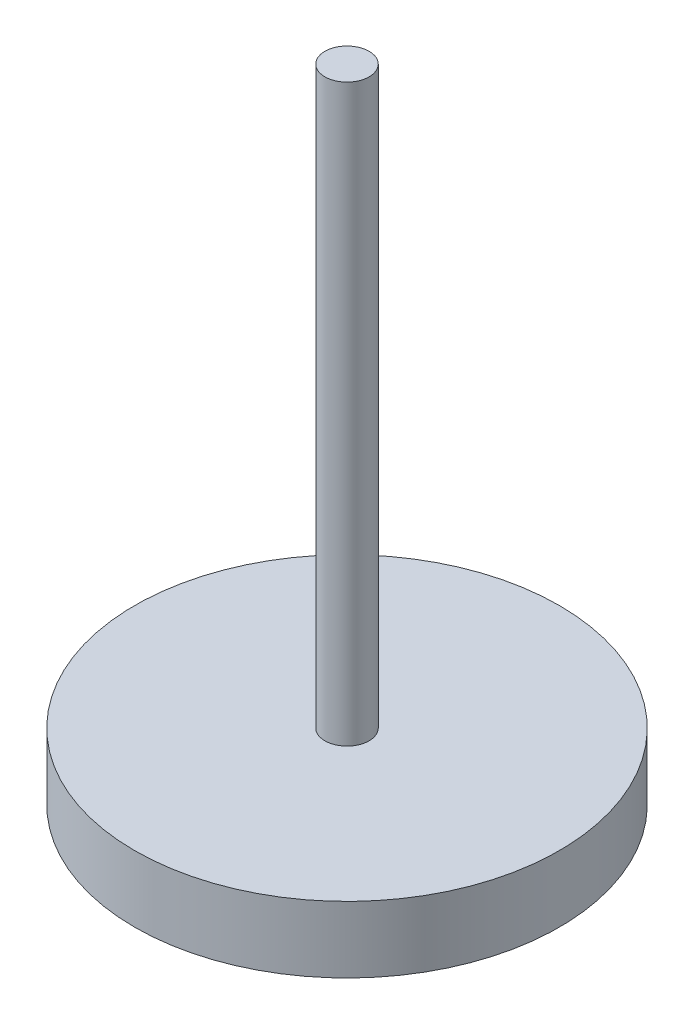
ISO-10303-21;
HEADER;
FILE_DESCRIPTION(('STEP AP214'),'2;1');
FILE_NAME('part.step','',(''),(''),'','','');
FILE_SCHEMA(('AUTOMOTIVE_DESIGN { 1 0 10303 214 1 1 1 1 }'));
ENDSEC;
DATA;
#1=APPLICATION_CONTEXT('core data for automotive mechanical design processes');
#2=APPLICATION_PROTOCOL_DEFINITION('international standard','automotive_design',2000,#1);
#3=PRODUCT_CONTEXT('',#1,'mechanical');
#4=PRODUCT('Part','Part','',(#3));
#5=PRODUCT_RELATED_PRODUCT_CATEGORY('part','',(#4));
#6=PRODUCT_DEFINITION_FORMATION('','',#4);
#7=PRODUCT_DEFINITION_CONTEXT('part definition',#1,'design');
#8=PRODUCT_DEFINITION('design','',#6,#7);
#9=PRODUCT_DEFINITION_SHAPE('','',#8);
#10=(LENGTH_UNIT() NAMED_UNIT(*) SI_UNIT(.MILLI.,.METRE.));
#11=(NAMED_UNIT(*) PLANE_ANGLE_UNIT() SI_UNIT($,.RADIAN.));
#12=(NAMED_UNIT(*) SI_UNIT($,.STERADIAN.) SOLID_ANGLE_UNIT());
#13=UNCERTAINTY_MEASURE_WITH_UNIT(LENGTH_MEASURE(1.E-05),#10,'distance_accuracy_value','');
#14=(GEOMETRIC_REPRESENTATION_CONTEXT(3) GLOBAL_UNCERTAINTY_ASSIGNED_CONTEXT((#13)) GLOBAL_UNIT_ASSIGNED_CONTEXT((#10,
#11,#12)) REPRESENTATION_CONTEXT('',''));
#15=CARTESIAN_POINT('',(0.,0.,0.));
#16=DIRECTION('',(0.,0.,1.));
#17=DIRECTION('',(1.,0.,0.));
#18=AXIS2_PLACEMENT_3D('',#15,#16,#17);
#19=CARTESIAN_POINT('',(0.,15.,0.));
#20=DIRECTION('',(0.,-1.,0.));
#21=DIRECTION('',(0.,0.,-1.));
#22=AXIS2_PLACEMENT_3D('',#19,#20,#21);
#23=CYLINDRICAL_SURFACE('',#22,48.);
#24=CARTESIAN_POINT('',(0.,15.,0.));
#25=DIRECTION('',(0.,1.,0.));
#26=DIRECTION('',(0.,0.,1.));
#27=AXIS2_PLACEMENT_3D('',#24,#25,#26);
#28=CIRCLE('',#27,48.);
#29=CARTESIAN_POINT('',(0.,15.,48.));
#30=VERTEX_POINT('',#29);
#31=EDGE_CURVE('E10',#30,#30,#28,.T.);
#32=ORIENTED_EDGE('',*,*,#31,.F.);
#33=EDGE_LOOP('',(#32));
#34=FACE_BOUND('',#33,.T.);
#35=CARTESIAN_POINT('',(0.,0.,0.));
#36=DIRECTION('',(0.,1.,0.));
#37=DIRECTION('',(0.,0.,1.));
#38=AXIS2_PLACEMENT_3D('',#35,#36,#37);
#39=CIRCLE('',#38,48.);
#40=CARTESIAN_POINT('',(0.,0.,48.));
#41=VERTEX_POINT('',#40);
#42=EDGE_CURVE('E38',#41,#41,#39,.T.);
#43=ORIENTED_EDGE('',*,*,#42,.T.);
#44=EDGE_LOOP('',(#43));
#45=FACE_BOUND('',#44,.T.);
#46=ADVANCED_FACE('F35',(#34,#45),#23,.T.);
#47=CARTESIAN_POINT('',(0.,15.,0.));
#48=DIRECTION('',(0.,1.,0.));
#49=DIRECTION('',(0.,0.,1.));
#50=AXIS2_PLACEMENT_3D('',#47,#48,#49);
#51=PLANE('',#50);
#52=CARTESIAN_POINT('',(0.,15.,0.));
#53=DIRECTION('',(0.,1.,0.));
#54=DIRECTION('',(0.,0.,1.));
#55=AXIS2_PLACEMENT_3D('',#52,#53,#54);
#56=CIRCLE('',#55,5.);
#57=CARTESIAN_POINT('',(0.,15.,5.));
#58=VERTEX_POINT('',#57);
#59=EDGE_CURVE('E47',#58,#58,#56,.T.);
#60=ORIENTED_EDGE('',*,*,#59,.F.);
#61=EDGE_LOOP('',(#60));
#62=FACE_BOUND('',#61,.T.);
#63=ORIENTED_EDGE('',*,*,#31,.T.);
#64=EDGE_LOOP('',(#63));
#65=FACE_BOUND('',#64,.T.);
#66=ADVANCED_FACE('F62',(#62,#65),#51,.T.);
#67=CARTESIAN_POINT('',(0.,0.,0.));
#68=DIRECTION('',(0.,1.,0.));
#69=DIRECTION('',(0.,0.,1.));
#70=AXIS2_PLACEMENT_3D('',#67,#68,#69);
#71=PLANE('',#70);
#72=ORIENTED_EDGE('',*,*,#42,.F.);
#73=EDGE_LOOP('',(#72));
#74=FACE_BOUND('',#73,.T.);
#75=ADVANCED_FACE('F58',(#74),#71,.F.);
#76=CARTESIAN_POINT('',(0.,145.,0.));
#77=DIRECTION('',(0.,-1.,0.));
#78=DIRECTION('',(0.,0.,-1.));
#79=AXIS2_PLACEMENT_3D('',#76,#77,#78);
#80=CYLINDRICAL_SURFACE('',#79,5.);
#81=CARTESIAN_POINT('',(0.,145.,0.));
#82=DIRECTION('',(0.,1.,0.));
#83=DIRECTION('',(0.,0.,1.));
#84=AXIS2_PLACEMENT_3D('',#81,#82,#83);
#85=CIRCLE('',#84,5.);
#86=CARTESIAN_POINT('',(0.,145.,5.));
#87=VERTEX_POINT('',#86);
#88=EDGE_CURVE('E45',#87,#87,#85,.T.);
#89=ORIENTED_EDGE('',*,*,#88,.F.);
#90=EDGE_LOOP('',(#89));
#91=FACE_BOUND('',#90,.T.);
#92=ORIENTED_EDGE('',*,*,#59,.T.);
#93=EDGE_LOOP('',(#92));
#94=FACE_BOUND('',#93,.T.);
#95=ADVANCED_FACE('F55',(#91,#94),#80,.T.);
#96=CARTESIAN_POINT('',(0.,145.,0.));
#97=DIRECTION('',(0.,1.,0.));
#98=DIRECTION('',(0.,0.,1.));
#99=AXIS2_PLACEMENT_3D('',#96,#97,#98);
#100=PLANE('',#99);
#101=ORIENTED_EDGE('',*,*,#88,.T.);
#102=EDGE_LOOP('',(#101));
#103=FACE_BOUND('',#102,.T.);
#104=ADVANCED_FACE('F53',(#103),#100,.T.);
#105=CLOSED_SHELL('',(#46,#66,#75,#95,#104));
#106=MANIFOLD_SOLID_BREP('B2',#105);
#107=ADVANCED_BREP_SHAPE_REPRESENTATION('',(#18,#106),#14);
#108=SHAPE_DEFINITION_REPRESENTATION(#9,#107);
ENDSEC;
END-ISO-10303-21;
